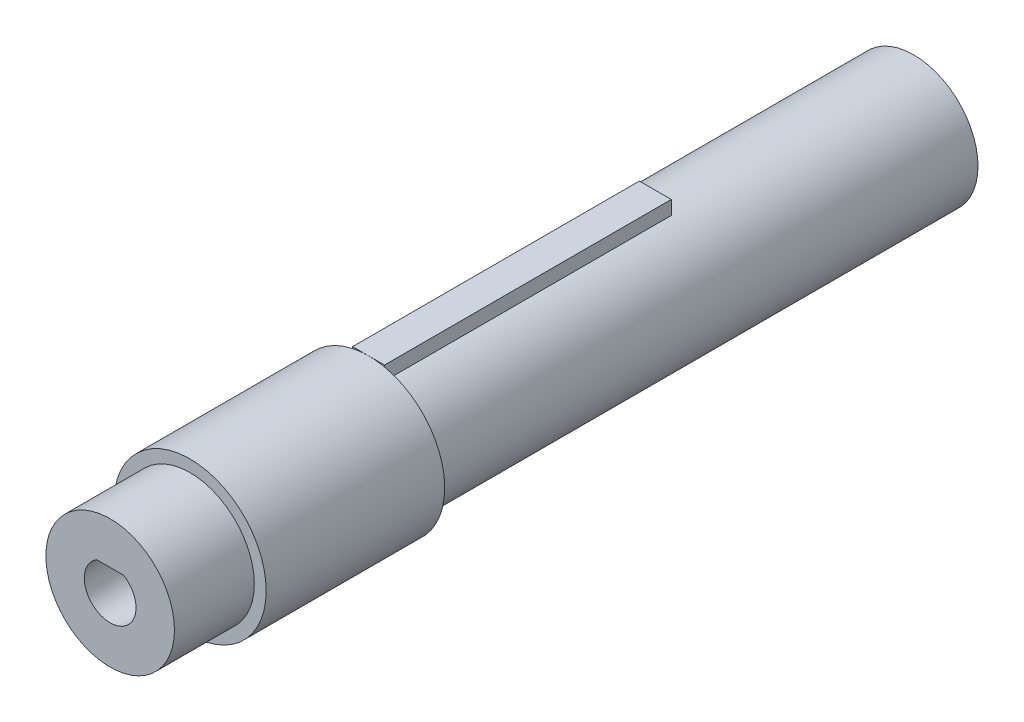
ISO-10303-21;
HEADER;
FILE_DESCRIPTION(('STEP AP214'),'2;1');
FILE_NAME('part.step','',(''),(''),'','','');
FILE_SCHEMA(('AUTOMOTIVE_DESIGN { 1 0 10303 214 1 1 1 1 }'));
ENDSEC;
DATA;
#1=APPLICATION_CONTEXT('core data for automotive mechanical design processes');
#2=APPLICATION_PROTOCOL_DEFINITION('international standard','automotive_design',2000,#1);
#3=PRODUCT_CONTEXT('',#1,'mechanical');
#4=PRODUCT('Part','Part','',(#3));
#5=PRODUCT_RELATED_PRODUCT_CATEGORY('part','',(#4));
#6=PRODUCT_DEFINITION_FORMATION('','',#4);
#7=PRODUCT_DEFINITION_CONTEXT('part definition',#1,'design');
#8=PRODUCT_DEFINITION('design','',#6,#7);
#9=PRODUCT_DEFINITION_SHAPE('','',#8);
#10=(LENGTH_UNIT() NAMED_UNIT(*) SI_UNIT(.MILLI.,.METRE.));
#11=(NAMED_UNIT(*) PLANE_ANGLE_UNIT() SI_UNIT($,.RADIAN.));
#12=(NAMED_UNIT(*) SI_UNIT($,.STERADIAN.) SOLID_ANGLE_UNIT());
#13=UNCERTAINTY_MEASURE_WITH_UNIT(LENGTH_MEASURE(1.E-05),#10,'distance_accuracy_value','');
#14=(GEOMETRIC_REPRESENTATION_CONTEXT(3) GLOBAL_UNCERTAINTY_ASSIGNED_CONTEXT((#13)) GLOBAL_UNIT_ASSIGNED_CONTEXT((#10,
#11,#12)) REPRESENTATION_CONTEXT('',''));
#15=CARTESIAN_POINT('',(0.,0.,0.));
#16=DIRECTION('',(0.,0.,1.));
#17=DIRECTION('',(1.,0.,0.));
#18=AXIS2_PLACEMENT_3D('',#15,#16,#17);
#19=CARTESIAN_POINT('',(0.,0.,80.));
#20=DIRECTION('',(0.,0.,-1.));
#21=DIRECTION('',(-1.,0.,0.));
#22=AXIS2_PLACEMENT_3D('',#19,#20,#21);
#23=CYLINDRICAL_SURFACE('',#22,6.4);
#24=CARTESIAN_POINT('',(0.,0.,72.0498));
#25=DIRECTION('',(0.,0.,1.));
#26=DIRECTION('',(1.,0.,0.));
#27=AXIS2_PLACEMENT_3D('',#24,#25,#26);
#28=CIRCLE('',#27,6.4);
#29=CARTESIAN_POINT('',(6.4,0.,72.0498));
#30=VERTEX_POINT('',#29);
#31=EDGE_CURVE('E47',#30,#30,#28,.T.);
#32=ORIENTED_EDGE('',*,*,#31,.T.);
#33=EDGE_LOOP('',(#32));
#34=FACE_BOUND('',#33,.T.);
#35=CARTESIAN_POINT('',(0.,0.,80.));
#36=DIRECTION('',(0.,0.,1.));
#37=DIRECTION('',(1.,0.,0.));
#38=AXIS2_PLACEMENT_3D('',#35,#36,#37);
#39=CIRCLE('',#38,6.4);
#40=CARTESIAN_POINT('',(6.4,0.,80.));
#41=VERTEX_POINT('',#40);
#42=EDGE_CURVE('E183',#41,#41,#39,.T.);
#43=ORIENTED_EDGE('',*,*,#42,.F.);
#44=EDGE_LOOP('',(#43));
#45=FACE_BOUND('',#44,.T.);
#46=ADVANCED_FACE('F43',(#34,#45),#23,.T.);
#47=CARTESIAN_POINT('',(0.,0.,54.275));
#48=DIRECTION('',(0.,0.,-1.));
#49=DIRECTION('',(-1.,0.,0.));
#50=AXIS2_PLACEMENT_3D('',#47,#48,#49);
#51=PLANE('',#50);
#52=DIRECTION('',(0.,-1.,0.));
#53=VECTOR('',#52,1.);
#54=CARTESIAN_POINT('',(-1.5875,3.5819,54.275));
#55=LINE('',#54,#53);
#56=CARTESIAN_POINT('',(-1.5875,7.5819,54.275));
#57=VERTEX_POINT('',#56);
#58=CARTESIAN_POINT('',(-1.5875,7.41384187584278,54.275));
#59=VERTEX_POINT('',#58);
#60=EDGE_CURVE('E122',#57,#59,#55,.T.);
#61=ORIENTED_EDGE('',*,*,#60,.T.);
#62=CARTESIAN_POINT('',(0.,0.,54.275));
#63=DIRECTION('',(0.,0.,-1.));
#64=DIRECTION('',(-1.,0.,0.));
#65=AXIS2_PLACEMENT_3D('',#62,#63,#64);
#66=CIRCLE('',#65,7.5819);
#67=CARTESIAN_POINT('',(0.,7.5819,54.275));
#68=VERTEX_POINT('',#67);
#69=EDGE_CURVE('E11',#59,#68,#66,.T.);
#70=ORIENTED_EDGE('',*,*,#69,.T.);
#71=DIRECTION('',(-1.,0.,0.));
#72=VECTOR('',#71,1.);
#73=CARTESIAN_POINT('',(-1.5875,7.5819,54.275));
#74=LINE('',#73,#72);
#75=EDGE_CURVE('E119',#68,#57,#74,.T.);
#76=ORIENTED_EDGE('',*,*,#75,.T.);
#77=EDGE_LOOP('',(#61,#70,#76));
#78=FACE_BOUND('',#77,.T.);
#79=ADVANCED_FACE('F118',(#78),#51,.F.);
#80=CARTESIAN_POINT('',(0.,0.,80.));
#81=DIRECTION('',(0.,0.,1.));
#82=DIRECTION('',(1.,0.,0.));
#83=AXIS2_PLACEMENT_3D('',#80,#81,#82);
#84=PLANE('',#83);
#85=ORIENTED_EDGE('',*,*,#42,.T.);
#86=EDGE_LOOP('',(#85));
#87=FACE_BOUND('',#86,.T.);
#88=DIRECTION('',(-1.,0.,0.));
#89=VECTOR('',#88,1.);
#90=CARTESIAN_POINT('',(-1.34632834033901,2.195,80.));
#91=LINE('',#90,#89);
#92=CARTESIAN_POINT('',(1.34632834033901,2.195,80.));
#93=VERTEX_POINT('',#92);
#94=CARTESIAN_POINT('',(-1.34632834033901,2.195,80.));
#95=VERTEX_POINT('',#94);
#96=EDGE_CURVE('E164',#93,#95,#91,.T.);
#97=ORIENTED_EDGE('',*,*,#96,.F.);
#98=CARTESIAN_POINT('',(0.,0.,80.));
#99=DIRECTION('',(0.,0.,1.));
#100=DIRECTION('',(1.,0.,0.));
#101=AXIS2_PLACEMENT_3D('',#98,#99,#100);
#102=CIRCLE('',#101,2.575);
#103=EDGE_CURVE('E160',#95,#93,#102,.T.);
#104=ORIENTED_EDGE('',*,*,#103,.F.);
#105=EDGE_LOOP('',(#97,#104));
#106=FACE_BOUND('',#105,.T.);
#107=ADVANCED_FACE('F237',(#87,#106),#84,.T.);
#108=CARTESIAN_POINT('',(0.,0.,0.));
#109=DIRECTION('',(0.,0.,1.));
#110=DIRECTION('',(1.,0.,0.));
#111=AXIS2_PLACEMENT_3D('',#108,#109,#110);
#112=PLANE('',#111);
#113=CARTESIAN_POINT('',(0.,0.,0.));
#114=DIRECTION('',(0.,0.,1.));
#115=DIRECTION('',(1.,0.,0.));
#116=AXIS2_PLACEMENT_3D('',#113,#114,#115);
#117=CIRCLE('',#116,6.4);
#118=CARTESIAN_POINT('',(6.4,0.,0.));
#119=VERTEX_POINT('',#118);
#120=EDGE_CURVE('E182',#119,#119,#117,.T.);
#121=ORIENTED_EDGE('',*,*,#120,.F.);
#122=EDGE_LOOP('',(#121));
#123=FACE_BOUND('',#122,.T.);
#124=CARTESIAN_POINT('',(0.,0.,0.));
#125=DIRECTION('',(0.,0.,1.));
#126=DIRECTION('',(1.,0.,0.));
#127=AXIS2_PLACEMENT_3D('',#124,#125,#126);
#128=CIRCLE('',#127,2.575);
#129=CARTESIAN_POINT('',(-1.34632834033901,2.195,0.));
#130=VERTEX_POINT('',#129);
#131=CARTESIAN_POINT('',(1.34632834033901,2.195,0.));
#132=VERTEX_POINT('',#131);
#133=EDGE_CURVE('E157',#130,#132,#128,.T.);
#134=ORIENTED_EDGE('',*,*,#133,.T.);
#135=DIRECTION('',(-1.,0.,0.));
#136=VECTOR('',#135,1.);
#137=CARTESIAN_POINT('',(-1.34632834033901,2.195,0.));
#138=LINE('',#137,#136);
#139=EDGE_CURVE('E165',#132,#130,#138,.T.);
#140=ORIENTED_EDGE('',*,*,#139,.T.);
#141=EDGE_LOOP('',(#134,#140));
#142=FACE_BOUND('',#141,.T.);
#143=ADVANCED_FACE('F242',(#123,#142),#112,.F.);
#144=DIRECTION('',(0.,0.,-1.));
#145=VECTOR('',#144,1.);
#146=CARTESIAN_POINT('',(1.5875,6.19998739918074,80.));
#147=LINE('',#146,#145);
#148=CARTESIAN_POINT('',(1.5875,6.19998739918074,25.725));
#149=VERTEX_POINT('',#148);
#150=CARTESIAN_POINT('',(1.5875,6.19998739918074,54.275));
#151=VERTEX_POINT('',#150);
#152=EDGE_CURVE('E187',#149,#151,#147,.F.);
#153=ORIENTED_EDGE('',*,*,#152,.T.);
#154=CARTESIAN_POINT('',(0.,0.,54.275));
#155=DIRECTION('',(0.,0.,-1.));
#156=DIRECTION('',(-1.,0.,0.));
#157=AXIS2_PLACEMENT_3D('',#154,#155,#156);
#158=CIRCLE('',#157,6.4);
#159=CARTESIAN_POINT('',(-1.5875,6.19998739918074,54.275));
#160=VERTEX_POINT('',#159);
#161=EDGE_CURVE('E211',#151,#160,#158,.T.);
#162=ORIENTED_EDGE('',*,*,#161,.T.);
#163=DIRECTION('',(0.,0.,-1.));
#164=VECTOR('',#163,1.);
#165=CARTESIAN_POINT('',(-1.5875,6.19998739918074,80.));
#166=LINE('',#165,#164);
#167=CARTESIAN_POINT('',(-1.5875,6.19998739918074,25.725));
#168=VERTEX_POINT('',#167);
#169=EDGE_CURVE('E68',#160,#168,#166,.T.);
#170=ORIENTED_EDGE('',*,*,#169,.T.);
#171=CARTESIAN_POINT('',(0.,0.,25.725));
#172=DIRECTION('',(0.,0.,-1.));
#173=DIRECTION('',(-1.,0.,0.));
#174=AXIS2_PLACEMENT_3D('',#171,#172,#173);
#175=CIRCLE('',#174,6.4);
#176=EDGE_CURVE('E53',#168,#149,#175,.T.);
#177=ORIENTED_EDGE('',*,*,#176,.T.);
#178=EDGE_LOOP('',(#153,#162,#170,#177));
#179=FACE_BOUND('',#178,.T.);
#180=ORIENTED_EDGE('',*,*,#120,.T.);
#181=EDGE_LOOP('',(#180));
#182=FACE_BOUND('',#181,.T.);
#183=ADVANCED_FACE('F45',(#179,#182),#23,.T.);
#184=CARTESIAN_POINT('',(0.,0.,80.));
#185=DIRECTION('',(0.,0.,-1.));
#186=DIRECTION('',(-1.,0.,0.));
#187=AXIS2_PLACEMENT_3D('',#184,#185,#186);
#188=CYLINDRICAL_SURFACE('',#187,2.575);
#189=ORIENTED_EDGE('',*,*,#133,.F.);
#190=DIRECTION('',(0.,0.,-1.));
#191=VECTOR('',#190,1.);
#192=CARTESIAN_POINT('',(-1.34632834033901,2.195,80.));
#193=LINE('',#192,#191);
#194=EDGE_CURVE('E168',#95,#130,#193,.T.);
#195=ORIENTED_EDGE('',*,*,#194,.F.);
#196=ORIENTED_EDGE('',*,*,#103,.T.);
#197=DIRECTION('',(0.,0.,-1.));
#198=VECTOR('',#197,1.);
#199=CARTESIAN_POINT('',(1.34632834033901,2.195,80.));
#200=LINE('',#199,#198);
#201=EDGE_CURVE('E178',#93,#132,#200,.T.);
#202=ORIENTED_EDGE('',*,*,#201,.T.);
#203=EDGE_LOOP('',(#189,#195,#196,#202));
#204=FACE_BOUND('',#203,.T.);
#205=ADVANCED_FACE('F241',(#204),#188,.F.);
#206=CARTESIAN_POINT('',(-1.34632834033901,2.195,80.));
#207=DIRECTION('',(0.,-1.,0.));
#208=DIRECTION('',(0.,0.,-1.));
#209=AXIS2_PLACEMENT_3D('',#206,#207,#208);
#210=PLANE('',#209);
#211=ORIENTED_EDGE('',*,*,#139,.F.);
#212=ORIENTED_EDGE('',*,*,#201,.F.);
#213=ORIENTED_EDGE('',*,*,#96,.T.);
#214=ORIENTED_EDGE('',*,*,#194,.T.);
#215=EDGE_LOOP('',(#211,#212,#213,#214));
#216=FACE_BOUND('',#215,.T.);
#217=ADVANCED_FACE('F247',(#216),#210,.T.);
#218=CARTESIAN_POINT('',(-1.5875,3.5819,25.725));
#219=DIRECTION('',(-1.,0.,0.));
#220=DIRECTION('',(0.,0.,1.));
#221=AXIS2_PLACEMENT_3D('',#218,#219,#220);
#222=PLANE('',#221);
#223=ORIENTED_EDGE('',*,*,#169,.F.);
#224=EDGE_CURVE('E137',#59,#160,#55,.T.);
#225=ORIENTED_EDGE('',*,*,#224,.F.);
#226=ORIENTED_EDGE('',*,*,#60,.F.);
#227=DIRECTION('',(0.,0.,1.));
#228=VECTOR('',#227,1.);
#229=CARTESIAN_POINT('',(-1.5875,7.5819,25.725));
#230=LINE('',#229,#228);
#231=CARTESIAN_POINT('',(-1.5875,7.5819,25.725));
#232=VERTEX_POINT('',#231);
#233=EDGE_CURVE('E129',#232,#57,#230,.T.);
#234=ORIENTED_EDGE('',*,*,#233,.F.);
#235=DIRECTION('',(0.,-1.,0.));
#236=VECTOR('',#235,1.);
#237=CARTESIAN_POINT('',(-1.5875,3.5819,25.725));
#238=LINE('',#237,#236);
#239=EDGE_CURVE('E150',#232,#168,#238,.T.);
#240=ORIENTED_EDGE('',*,*,#239,.T.);
#241=EDGE_LOOP('',(#223,#225,#226,#234,#240));
#242=FACE_BOUND('',#241,.T.);
#243=ADVANCED_FACE('F261',(#242),#222,.T.);
#244=CARTESIAN_POINT('',(1.5875,7.5819,25.725));
#245=DIRECTION('',(1.,0.,0.));
#246=DIRECTION('',(0.,0.,-1.));
#247=AXIS2_PLACEMENT_3D('',#244,#245,#246);
#248=PLANE('',#247);
#249=ORIENTED_EDGE('',*,*,#152,.F.);
#250=DIRECTION('',(0.,1.,0.));
#251=VECTOR('',#250,1.);
#252=CARTESIAN_POINT('',(1.5875,7.5819,25.725));
#253=LINE('',#252,#251);
#254=CARTESIAN_POINT('',(1.5875,7.5819,25.725));
#255=VERTEX_POINT('',#254);
#256=EDGE_CURVE('E144',#149,#255,#253,.T.);
#257=ORIENTED_EDGE('',*,*,#256,.T.);
#258=DIRECTION('',(0.,0.,1.));
#259=VECTOR('',#258,1.);
#260=CARTESIAN_POINT('',(1.5875,7.5819,25.725));
#261=LINE('',#260,#259);
#262=CARTESIAN_POINT('',(1.5875,7.5819,54.275));
#263=VERTEX_POINT('',#262);
#264=EDGE_CURVE('E154',#255,#263,#261,.T.);
#265=ORIENTED_EDGE('',*,*,#264,.T.);
#266=DIRECTION('',(0.,1.,0.));
#267=VECTOR('',#266,1.);
#268=CARTESIAN_POINT('',(1.5875,7.5819,54.275));
#269=LINE('',#268,#267);
#270=CARTESIAN_POINT('',(1.5875,7.41384187584278,54.275));
#271=VERTEX_POINT('',#270);
#272=EDGE_CURVE('E134',#271,#263,#269,.T.);
#273=ORIENTED_EDGE('',*,*,#272,.F.);
#274=EDGE_CURVE('E131',#151,#271,#269,.T.);
#275=ORIENTED_EDGE('',*,*,#274,.F.);
#276=EDGE_LOOP('',(#249,#257,#265,#273,#275));
#277=FACE_BOUND('',#276,.T.);
#278=ADVANCED_FACE('F204',(#277),#248,.T.);
#279=CARTESIAN_POINT('',(-1.5875,7.5819,25.725));
#280=DIRECTION('',(0.,1.,0.));
#281=DIRECTION('',(0.,0.,1.));
#282=AXIS2_PLACEMENT_3D('',#279,#280,#281);
#283=PLANE('',#282);
#284=ORIENTED_EDGE('',*,*,#233,.T.);
#285=ORIENTED_EDGE('',*,*,#75,.F.);
#286=EDGE_CURVE('E127',#263,#68,#74,.T.);
#287=ORIENTED_EDGE('',*,*,#286,.F.);
#288=ORIENTED_EDGE('',*,*,#264,.F.);
#289=DIRECTION('',(-1.,0.,0.));
#290=VECTOR('',#289,1.);
#291=CARTESIAN_POINT('',(-1.5875,7.5819,25.725));
#292=LINE('',#291,#290);
#293=EDGE_CURVE('E147',#255,#232,#292,.T.);
#294=ORIENTED_EDGE('',*,*,#293,.T.);
#295=EDGE_LOOP('',(#284,#285,#287,#288,#294));
#296=FACE_BOUND('',#295,.T.);
#297=ADVANCED_FACE('F125',(#296),#283,.T.);
#298=CARTESIAN_POINT('',(0.,0.,25.725));
#299=DIRECTION('',(0.,0.,-1.));
#300=DIRECTION('',(-1.,0.,0.));
#301=AXIS2_PLACEMENT_3D('',#298,#299,#300);
#302=PLANE('',#301);
#303=ORIENTED_EDGE('',*,*,#176,.F.);
#304=ORIENTED_EDGE('',*,*,#239,.F.);
#305=ORIENTED_EDGE('',*,*,#293,.F.);
#306=ORIENTED_EDGE('',*,*,#256,.F.);
#307=EDGE_LOOP('',(#303,#304,#305,#306));
#308=FACE_BOUND('',#307,.T.);
#309=ADVANCED_FACE('F206',(#308),#302,.T.);
#310=ORIENTED_EDGE('',*,*,#286,.T.);
#311=CARTESIAN_POINT('',(0.,0.,54.275));
#312=DIRECTION('',(0.,0.,-1.));
#313=DIRECTION('',(-1.,0.,0.));
#314=AXIS2_PLACEMENT_3D('',#311,#312,#313);
#315=CIRCLE('',#314,7.5819);
#316=EDGE_CURVE('E106',#271,#68,#315,.F.);
#317=ORIENTED_EDGE('',*,*,#316,.F.);
#318=ORIENTED_EDGE('',*,*,#272,.T.);
#319=EDGE_LOOP('',(#310,#317,#318));
#320=FACE_BOUND('',#319,.T.);
#321=ADVANCED_FACE('F133',(#320),#51,.F.);
#322=CARTESIAN_POINT('',(0.,0.,54.275));
#323=DIRECTION('',(0.,0.,-1.));
#324=DIRECTION('',(-1.,0.,0.));
#325=AXIS2_PLACEMENT_3D('',#322,#323,#324);
#326=PLANE('',#325);
#327=EDGE_CURVE('E60',#59,#271,#315,.F.);
#328=ORIENTED_EDGE('',*,*,#327,.F.);
#329=ORIENTED_EDGE('',*,*,#224,.T.);
#330=ORIENTED_EDGE('',*,*,#161,.F.);
#331=ORIENTED_EDGE('',*,*,#274,.T.);
#332=EDGE_LOOP('',(#328,#329,#330,#331));
#333=FACE_BOUND('',#332,.T.);
#334=ADVANCED_FACE('F223',(#333),#326,.T.);
#335=CARTESIAN_POINT('',(0.,0.,32.8301483828869));
#336=DIRECTION('',(0.,0.,1.));
#337=DIRECTION('',(1.,0.,0.));
#338=AXIS2_PLACEMENT_3D('',#335,#336,#337);
#339=CYLINDRICAL_SURFACE('',#338,7.5819);
#340=CARTESIAN_POINT('',(0.,0.,72.0498));
#341=DIRECTION('',(0.,0.,1.));
#342=DIRECTION('',(1.,0.,0.));
#343=AXIS2_PLACEMENT_3D('',#340,#341,#342);
#344=CIRCLE('',#343,7.5819);
#345=CARTESIAN_POINT('',(7.5819,0.,72.0498));
#346=VERTEX_POINT('',#345);
#347=EDGE_CURVE('E113',#346,#346,#344,.T.);
#348=ORIENTED_EDGE('',*,*,#347,.F.);
#349=EDGE_LOOP('',(#348));
#350=FACE_BOUND('',#349,.T.);
#351=ORIENTED_EDGE('',*,*,#316,.T.);
#352=ORIENTED_EDGE('',*,*,#69,.F.);
#353=ORIENTED_EDGE('',*,*,#327,.T.);
#354=EDGE_LOOP('',(#351,#352,#353));
#355=FACE_BOUND('',#354,.T.);
#356=ADVANCED_FACE('F107',(#350,#355),#339,.T.);
#357=CARTESIAN_POINT('',(0.,0.,72.0498));
#358=DIRECTION('',(0.,0.,1.));
#359=DIRECTION('',(1.,0.,0.));
#360=AXIS2_PLACEMENT_3D('',#357,#358,#359);
#361=PLANE('',#360);
#362=ORIENTED_EDGE('',*,*,#31,.F.);
#363=EDGE_LOOP('',(#362));
#364=FACE_BOUND('',#363,.T.);
#365=ORIENTED_EDGE('',*,*,#347,.T.);
#366=EDGE_LOOP('',(#365));
#367=FACE_BOUND('',#366,.T.);
#368=ADVANCED_FACE('F220',(#364,#367),#361,.T.);
#369=CLOSED_SHELL('',(#46,#79,#107,#143,#183,#205,#217,#243,#278,#297,#309,#321,#334,#356,#368));
#370=MANIFOLD_SOLID_BREP('B2',#369);
#371=ADVANCED_BREP_SHAPE_REPRESENTATION('',(#18,#370),#14);
#372=SHAPE_DEFINITION_REPRESENTATION(#9,#371);
ENDSEC;
END-ISO-10303-21;
